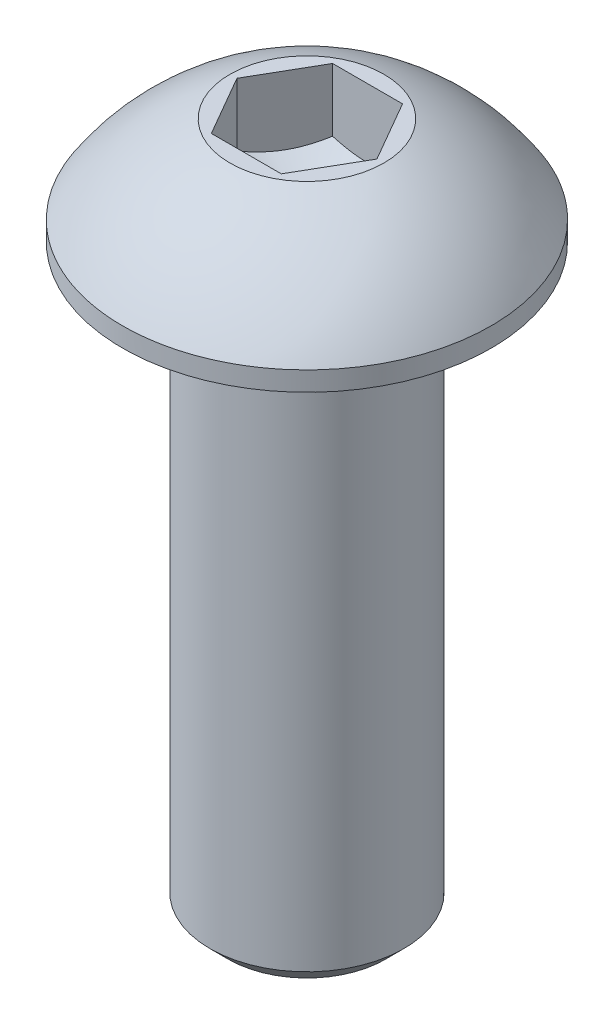
ISO-10303-21;
HEADER;
FILE_DESCRIPTION(('STEP AP214'),'2;1');
FILE_NAME('part.step','',(''),(''),'','','');
FILE_SCHEMA(('AUTOMOTIVE_DESIGN { 1 0 10303 214 1 1 1 1 }'));
ENDSEC;
DATA;
#1=APPLICATION_CONTEXT('core data for automotive mechanical design processes');
#2=APPLICATION_PROTOCOL_DEFINITION('international standard','automotive_design',2000,#1);
#3=PRODUCT_CONTEXT('',#1,'mechanical');
#4=PRODUCT('Part','Part','',(#3));
#5=PRODUCT_RELATED_PRODUCT_CATEGORY('part','',(#4));
#6=PRODUCT_DEFINITION_FORMATION('','',#4);
#7=PRODUCT_DEFINITION_CONTEXT('part definition',#1,'design');
#8=PRODUCT_DEFINITION('design','',#6,#7);
#9=PRODUCT_DEFINITION_SHAPE('','',#8);
#10=(LENGTH_UNIT() NAMED_UNIT(*) SI_UNIT(.MILLI.,.METRE.));
#11=(NAMED_UNIT(*) PLANE_ANGLE_UNIT() SI_UNIT($,.RADIAN.));
#12=(NAMED_UNIT(*) SI_UNIT($,.STERADIAN.) SOLID_ANGLE_UNIT());
#13=UNCERTAINTY_MEASURE_WITH_UNIT(LENGTH_MEASURE(1.E-05),#10,'distance_accuracy_value','');
#14=(GEOMETRIC_REPRESENTATION_CONTEXT(3) GLOBAL_UNCERTAINTY_ASSIGNED_CONTEXT((#13)) GLOBAL_UNIT_ASSIGNED_CONTEXT((#10,
#11,#12)) REPRESENTATION_CONTEXT('',''));
#15=CARTESIAN_POINT('',(0.,0.,0.));
#16=DIRECTION('',(0.,0.,1.));
#17=DIRECTION('',(1.,0.,0.));
#18=AXIS2_PLACEMENT_3D('',#15,#16,#17);
#19=CARTESIAN_POINT('',(-15.0000000000002,102.555381555476,30.9807621135335));
#20=DIRECTION('',(0.,1.,0.));
#21=DIRECTION('',(-1.,0.,0.));
#22=AXIS2_PLACEMENT_3D('',#19,#20,#21);
#23=CONICAL_SURFACE('',#22,1.45182112760699,1.04719755109359);
#24=CARTESIAN_POINT('',(-15.0000000000002,101.717172236562,30.980762113785));
#25=VERTEX_POINT('',#24);
#26=VERTEX_LOOP('',#25);
#27=FACE_BOUND('',#26,.T.);
#28=CARTESIAN_POINT('',(-13.5574990655018,102.550000607274,30.9807603764684));
#29=CARTESIAN_POINT('',(-13.5891805205812,102.531703843267,31.0356676529348));
#30=CARTESIAN_POINT('',(-13.62113547963,102.515065492705,31.0910488953439));
#31=CARTESIAN_POINT('',(-13.685598425334,102.486027407709,31.2027697944256));
#32=CARTESIAN_POINT('',(-13.7181075552304,102.473637942175,31.2591114323581));
#33=CARTESIAN_POINT('',(-13.7827225917517,102.454358012229,31.3710958918053));
#34=CARTESIAN_POINT('',(-13.8148185686046,102.447339054388,31.4267215037488));
#35=CARTESIAN_POINT('',(-13.8791609966882,102.438970015237,31.5382335123856));
#36=CARTESIAN_POINT('',(-13.9114072149847,102.437612989256,31.5941195053833));
#37=CARTESIAN_POINT('',(-13.9716827611401,102.44048562008,31.6985831898622));
#38=CARTESIAN_POINT('',(-13.9997211254395,102.444019311747,31.7471765423253));
#39=CARTESIAN_POINT('',(-14.0556146828759,102.455206810443,31.8440457927401));
#40=CARTESIAN_POINT('',(-14.0834696818395,102.462864438671,31.8923213541696));
#41=CARTESIAN_POINT('',(-14.1394779717146,102.48200201036,31.9893894475137));
#42=CARTESIAN_POINT('',(-14.1676241577382,102.493563031193,32.0381696659323));
#43=CARTESIAN_POINT('',(-14.2234962841293,102.519797677775,32.1350017740761));
#44=CARTESIAN_POINT('',(-14.251222942539,102.534465133045,32.1830549082417));
#45=CARTESIAN_POINT('',(-14.2787505845651,102.550379544181,32.2307631266443));
#46=B_SPLINE_CURVE_WITH_KNOTS('',3,(#28,#29,#30,#31,#32,#33,#34,#35,#36,#37,#38,#39,#40,#41,#42,
#43,#44,#45),.UNSPECIFIED.,.F.,.F.,(4,2,2,2,2,2,2,2,4),(0.,0.198016347622382,0.396507952132164,
0.590087601476021,0.78342974478089,0.951909558633603,1.1205457534758,1.2929254762051,
1.46496595034987),.UNSPECIFIED.);
#47=CARTESIAN_POINT('',(-13.5574990630935,102.550000540865,30.9807620206986));
#48=VERTEX_POINT('',#47);
#49=CARTESIAN_POINT('',(-14.2787492620422,102.550379666997,32.2307626091431));
#50=VERTEX_POINT('',#49);
#51=EDGE_CURVE('E179',#48,#50,#46,.T.);
#52=ORIENTED_EDGE('',*,*,#51,.F.);
#53=CARTESIAN_POINT('',(-14.2787504943466,102.550379471601,29.730760991602));
#54=CARTESIAN_POINT('',(-14.2470584298008,102.532051909017,29.7856867500078));
#55=CARTESIAN_POINT('',(-14.2150927772445,102.515380739633,29.841086564187));
#56=CARTESIAN_POINT('',(-14.1506074004958,102.48627437793,29.9528463670318));
#57=CARTESIAN_POINT('',(-14.1180865267501,102.473849490067,30.0092083477771));
#58=CARTESIAN_POINT('',(-14.0534475659173,102.454499072358,30.1212342630503));
#59=CARTESIAN_POINT('',(-14.021339445647,102.44744498488,30.1768809234764));
#60=CARTESIAN_POINT('',(-13.9569712944532,102.439008207814,30.2884375148538));
#61=CARTESIAN_POINT('',(-13.9247114989968,102.437618552084,30.3443470377239));
#62=CARTESIAN_POINT('',(-13.8644354281458,102.440434378395,30.4488116310948));
#63=CARTESIAN_POINT('',(-13.8364102202509,102.44393910656,30.4973821823196));
#64=CARTESIAN_POINT('',(-13.7805419182131,102.455067208677,30.5942076626616));
#65=CARTESIAN_POINT('',(-13.7526990169822,102.462694397776,30.6424622574421));
#66=CARTESIAN_POINT('',(-13.6967146777994,102.481770811203,30.7394888417539));
#67=CARTESIAN_POINT('',(-13.6685803224992,102.493301081399,30.7882485563276));
#68=CARTESIAN_POINT('',(-13.6127311824328,102.519475784029,30.8850408268371));
#69=CARTESIAN_POINT('',(-13.5850156823802,102.534114058097,30.9330746224374));
#70=CARTESIAN_POINT('',(-13.5574991160017,102.550000510319,30.9807636455933));
#71=B_SPLINE_CURVE_WITH_KNOTS('',3,(#53,#54,#55,#56,#57,#58,#59,#60,#61,#62,#63,#64,#65,#66,#67,
#68,#69,#70),.UNSPECIFIED.,.F.,.F.,(4,2,2,2,2,2,2,2,4),(0.,0.198103544046829,0.396684468192307,
0.590348093615976,0.783773478653186,0.952169177535142,1.12072098627908,1.2930125001826,
1.46496576037078),.UNSPECIFIED.);
#72=CARTESIAN_POINT('',(-14.2787488271113,102.550379803604,29.7307615957074));
#73=VERTEX_POINT('',#72);
#74=EDGE_CURVE('E21',#73,#48,#71,.T.);
#75=ORIENTED_EDGE('',*,*,#74,.F.);
#76=CARTESIAN_POINT('',(-15.7212520262085,102.550379872106,29.7307622375312));
#77=CARTESIAN_POINT('',(-15.6620437384385,102.533293767625,29.7307621580679));
#78=CARTESIAN_POINT('',(-15.6023673220094,102.517651639482,29.7307621254693));
#79=CARTESIAN_POINT('',(-15.482046005357,102.490006985419,29.7307621015713));
#80=CARTESIAN_POINT('',(-15.4213992550071,102.478012585961,29.7307621103633));
#81=CARTESIAN_POINT('',(-15.3007855761183,102.458724290398,29.73076211663));
#82=CARTESIAN_POINT('',(-15.2408355941973,102.451327651119,29.7307621143628));
#83=CARTESIAN_POINT('',(-15.1205901111891,102.441398176661,29.7307621127051));
#84=CARTESIAN_POINT('',(-15.060295055565,102.43886007296,29.7307621133114));
#85=CARTESIAN_POINT('',(-14.9397049409569,102.438860073232,29.7307621137556));
#86=CARTESIAN_POINT('',(-14.879409881973,102.441398177498,29.7307621135934));
#87=CARTESIAN_POINT('',(-14.7591643917228,102.45132765201,29.7307621134736));
#88=CARTESIAN_POINT('',(-14.6992144059197,102.458724290785,29.7307621135162));
#89=CARTESIAN_POINT('',(-14.5786007210093,102.478012592343,29.7307621135512));
#90=CARTESIAN_POINT('',(-14.5179539685635,102.490006998467,29.7307621135423));
#91=CARTESIAN_POINT('',(-14.3976326416881,102.517651640784,29.7307621135247));
#92=CARTESIAN_POINT('',(-14.3379562171402,102.533293750546,29.7307621135159));
#93=CARTESIAN_POINT('',(-14.2787479138666,102.550379808163,29.7307621135335));
#94=B_SPLINE_CURVE_WITH_KNOTS('',3,(#76,#77,#78,#79,#80,#81,#82,#83,#84,#85,#86,#87,#88,#89,#90,
#91,#92,#93),.UNSPECIFIED.,.F.,.F.,(4,2,2,2,2,2,2,2,4),(0.,0.184929667346248,0.37026835551581,
0.551300594741303,0.732136413949939,0.912972243591181,1.09400449357037,1.2793431927614,
1.4642728697994),.UNSPECIFIED.);
#95=CARTESIAN_POINT('',(-15.7212507379525,102.550379667054,29.7307616179303));
#96=VERTEX_POINT('',#95);
#97=EDGE_CURVE('E96',#96,#73,#94,.T.);
#98=ORIENTED_EDGE('',*,*,#97,.F.);
#99=CARTESIAN_POINT('',(-16.4425009344978,102.550000607324,30.9807638505793));
#100=CARTESIAN_POINT('',(-16.4108194794134,102.531703843322,30.9258565741157));
#101=CARTESIAN_POINT('',(-16.3788645203626,102.515065492762,30.870475331708));
#102=CARTESIAN_POINT('',(-16.3144015746578,102.486027407767,30.7587544326283));
#103=CARTESIAN_POINT('',(-16.2818924447624,102.473637942234,30.7024127946962));
#104=CARTESIAN_POINT('',(-16.2172774082421,102.454358012288,30.5904283352499));
#105=CARTESIAN_POINT('',(-16.1851814313894,102.447339054447,30.534802723307));
#106=CARTESIAN_POINT('',(-16.1208390033063,102.438970015297,30.4232907146714));
#107=CARTESIAN_POINT('',(-16.0885927850102,102.437612989317,30.3674047216743));
#108=CARTESIAN_POINT('',(-16.0283172388561,102.440485620141,30.2629410371976));
#109=CARTESIAN_POINT('',(-16.0002788745577,102.444019311808,30.2143476847363));
#110=CARTESIAN_POINT('',(-15.9443853171233,102.455206810504,30.1174784343248));
#111=CARTESIAN_POINT('',(-15.9165303181606,102.462864438732,30.069202872897));
#112=CARTESIAN_POINT('',(-15.8605220282875,102.48200201042,29.9721347795563));
#113=CARTESIAN_POINT('',(-15.8323758422649,102.493563031253,29.9233545611394));
#114=CARTESIAN_POINT('',(-15.7765037158758,102.519797677834,29.8265224529991));
#115=CARTESIAN_POINT('',(-15.7487770574671,102.534465133103,29.7784693188353));
#116=CARTESIAN_POINT('',(-15.721249415442,102.550379544239,29.7307611004344));
#117=B_SPLINE_CURVE_WITH_KNOTS('',3,(#99,#100,#101,#102,#103,#104,#105,#106,#107,#108,#109,#110,
#111,#112,#113,#114,#115,#116),.UNSPECIFIED.,.F.,.F.,(4,2,2,2,2,2,2,2,4),(0.,0.198016347619926,
0.396507952127413,0.590087601469302,0.783429744772117,0.951909558619024,1.12054575345543,
1.29292547617855,1.46496595031711),.UNSPECIFIED.);
#118=CARTESIAN_POINT('',(-16.4425009368986,102.550000540922,30.9807622063665));
#119=VERTEX_POINT('',#118);
#120=EDGE_CURVE('E162',#119,#96,#117,.T.);
#121=ORIENTED_EDGE('',*,*,#120,.F.);
#122=CARTESIAN_POINT('',(-15.7212493477698,102.5503795772,32.2307633239423));
#123=CARTESIAN_POINT('',(-15.7529414630259,102.532051972953,32.1758375963039));
#124=CARTESIAN_POINT('',(-15.7849071388111,102.51538078324,32.1204377905421));
#125=CARTESIAN_POINT('',(-15.8493925376681,102.486274400243,32.00867798507));
#126=CARTESIAN_POINT('',(-15.881913410231,102.473849511427,31.9523159932384));
#127=CARTESIAN_POINT('',(-15.9465523748812,102.454499087774,31.8402900620072));
#128=CARTESIAN_POINT('',(-15.9786604999778,102.44744499532,31.7846433965995));
#129=CARTESIAN_POINT('',(-16.0430286594051,102.43900821068,31.6730867934102));
#130=CARTESIAN_POINT('',(-16.0752884582712,102.437618552368,31.6171772637107));
#131=CARTESIAN_POINT('',(-16.1355645357735,102.440434374833,31.5127126582364));
#132=CARTESIAN_POINT('',(-16.1635897468415,102.443939101563,31.4641421017081));
#133=CARTESIAN_POINT('',(-16.2194580550697,102.455067201916,31.3673166107821));
#134=CARTESIAN_POINT('',(-16.2473009593182,102.462694390676,31.3190620107204));
#135=CARTESIAN_POINT('',(-16.3032853049824,102.48177080446,31.2220354151333));
#136=CARTESIAN_POINT('',(-16.3314196637412,102.493301075426,31.1732756945762));
#137=CARTESIAN_POINT('',(-16.3872688107207,102.519475780468,31.0764834121068));
#138=CARTESIAN_POINT('',(-16.414984314227,102.534114056186,31.0284496105316));
#139=CARTESIAN_POINT('',(-16.4425008839922,102.550000510377,30.980760581485));
#140=B_SPLINE_CURVE_WITH_KNOTS('',3,(#122,#123,#124,#125,#126,#127,#128,#129,#130,#131,#132,
#133,#134,#135,#136,#137,#138,#139),.UNSPECIFIED.,.F.,.F.,(4,2,2,2,2,2,2,2,4),(0.,
0.198103571827459,0.396684522252665,0.590348169774138,0.783773577541586,0.95216929465424,
1.12072112126508,1.29301265590712,1.46496593733162),.UNSPECIFIED.);
#141=CARTESIAN_POINT('',(-15.7212506140921,102.550379679614,32.2307627057194));
#142=VERTEX_POINT('',#141);
#143=EDGE_CURVE('E168',#142,#119,#140,.T.);
#144=ORIENTED_EDGE('',*,*,#143,.F.);
#145=CARTESIAN_POINT('',(-14.2787479737748,102.550379872055,32.2307619895269));
#146=CARTESIAN_POINT('',(-14.3379562615037,102.533293767661,32.2307620689968));
#147=CARTESIAN_POINT('',(-14.3976326778803,102.517651639561,32.2307621015973));
#148=CARTESIAN_POINT('',(-14.517953994407,102.490006985542,32.2307621254961));
#149=CARTESIAN_POINT('',(-14.5786007446837,102.478012586085,32.230762116703));
#150=CARTESIAN_POINT('',(-14.6992144235572,102.458724290498,32.2307621104376));
#151=CARTESIAN_POINT('',(-14.7591644055377,102.451327651204,32.2307621127071));
#152=CARTESIAN_POINT('',(-14.8794098886764,102.44139817673,32.2307621143591));
#153=CARTESIAN_POINT('',(-14.9397049443716,102.43886007303,32.2307621137448));
#154=CARTESIAN_POINT('',(-15.0602950424179,102.438860073295,32.2307621133006));
#155=CARTESIAN_POINT('',(-15.1205900847689,102.441398176148,32.2307621134707));
#156=CARTESIAN_POINT('',(-15.240835542019,102.451327645259,32.2307621135964));
#157=CARTESIAN_POINT('',(-15.3007855114554,102.458724280038,32.2307621135516));
#158=CARTESIAN_POINT('',(-15.4213991632183,102.478012571422,32.2307621135149));
#159=CARTESIAN_POINT('',(-15.482045898902,102.49000697128,32.2307621135242));
#160=CARTESIAN_POINT('',(-15.6023671929273,102.517651599646,32.2307621135428));
#161=CARTESIAN_POINT('',(-15.6620436013844,102.53329370173,32.230762113552));
#162=CARTESIAN_POINT('',(-15.7212518888142,102.550379751289,32.2307621135335));
#163=B_SPLINE_CURVE_WITH_KNOTS('',3,(#145,#146,#147,#148,#149,#150,#151,#152,#153,#154,#155,
#156,#157,#158,#159,#160,#161,#162),.UNSPECIFIED.,.F.,.F.,(4,2,2,2,2,2,2,2,4),(0.,
0.184929667161365,0.370268355116823,0.551300594525385,0.732136413937957,0.912972193728789,
1.09400439364097,1.27934303992631,1.4642726645233),.UNSPECIFIED.);
#164=EDGE_CURVE('E174',#50,#142,#163,.T.);
#165=ORIENTED_EDGE('',*,*,#164,.F.);
#166=EDGE_LOOP('',(#52,#75,#98,#121,#144,#165));
#167=FACE_BOUND('',#166,.T.);
#168=ADVANCED_FACE('F17',(#27,#167),#23,.F.);
#169=CARTESIAN_POINT('',(-13.5457747860707,101.610428354967,31.001083108212));
#170=DIRECTION('',(-0.866156744758905,0.,0.499772441725889));
#171=DIRECTION('',(0.499772441725889,0.,0.866156744758905));
#172=AXIS2_PLACEMENT_3D('',#169,#170,#171);
#173=PLANE('',#172);
#174=ORIENTED_EDGE('',*,*,#74,.T.);
#175=DIRECTION('',(0.,1.,0.));
#176=VECTOR('',#175,1.);
#177=CARTESIAN_POINT('',(-13.5575000000002,101.610428354967,30.9807621135335));
#178=LINE('',#177,#176);
#179=CARTESIAN_POINT('',(-13.5574998872849,103.85,30.9807627002865));
#180=VERTEX_POINT('',#179);
#181=EDGE_CURVE('E85',#180,#48,#178,.F.);
#182=ORIENTED_EDGE('',*,*,#181,.F.);
#183=DIRECTION('',(0.499772441725942,0.,0.866156744758874));
#184=VECTOR('',#183,1.);
#185=CARTESIAN_POINT('',(-14.2787500000003,103.85,29.7307621135335));
#186=LINE('',#185,#184);
#187=CARTESIAN_POINT('',(-14.2787470566511,103.85,29.7307621135335));
#188=VERTEX_POINT('',#187);
#189=EDGE_CURVE('E79',#188,#180,#186,.T.);
#190=ORIENTED_EDGE('',*,*,#189,.F.);
#191=DIRECTION('',(0.,1.,0.));
#192=VECTOR('',#191,1.);
#193=CARTESIAN_POINT('',(-14.2787470566511,101.610428354967,29.7307621135335));
#194=LINE('',#193,#192);
#195=EDGE_CURVE('E82',#73,#188,#194,.T.);
#196=ORIENTED_EDGE('',*,*,#195,.F.);
#197=EDGE_LOOP('',(#174,#182,#190,#196));
#198=FACE_BOUND('',#197,.T.);
#199=ADVANCED_FACE('F81',(#198),#173,.T.);
#200=CARTESIAN_POINT('',(-14.2904752139297,101.610428354967,32.2510831082121));
#201=DIRECTION('',(-0.866156744758906,0.,-0.499772441725888));
#202=DIRECTION('',(-0.499772441725888,0.,0.866156744758906));
#203=AXIS2_PLACEMENT_3D('',#200,#201,#202);
#204=PLANE('',#203);
#205=ORIENTED_EDGE('',*,*,#51,.T.);
#206=DIRECTION('',(0.,1.,0.));
#207=VECTOR('',#206,1.);
#208=CARTESIAN_POINT('',(-14.2787500000002,101.610428354967,32.2307621135335));
#209=LINE('',#208,#207);
#210=CARTESIAN_POINT('',(-14.2787502258028,103.85,32.2307621135335));
#211=VERTEX_POINT('',#210);
#212=EDGE_CURVE('E178',#211,#50,#209,.F.);
#213=ORIENTED_EDGE('',*,*,#212,.F.);
#214=DIRECTION('',(-0.499772441725887,0.,0.866156744758906));
#215=VECTOR('',#214,1.);
#216=CARTESIAN_POINT('',(-13.5575000000002,103.85,30.9807621135335));
#217=LINE('',#216,#215);
#218=EDGE_CURVE('E90',#180,#211,#217,.T.);
#219=ORIENTED_EDGE('',*,*,#218,.F.);
#220=ORIENTED_EDGE('',*,*,#181,.T.);
#221=EDGE_LOOP('',(#205,#213,#219,#220));
#222=FACE_BOUND('',#221,.T.);
#223=ADVANCED_FACE('F187',(#222),#204,.T.);
#224=CARTESIAN_POINT('',(-15.7447111053966,101.610428354967,32.2307621135335));
#225=DIRECTION('',(0.,0.,-1.));
#226=DIRECTION('',(-1.,0.,0.));
#227=AXIS2_PLACEMENT_3D('',#224,#225,#226);
#228=PLANE('',#227);
#229=ORIENTED_EDGE('',*,*,#164,.T.);
#230=DIRECTION('',(0.,1.,0.));
#231=VECTOR('',#230,1.);
#232=CARTESIAN_POINT('',(-15.7212500000002,101.610428354967,32.2307621135335));
#233=LINE('',#232,#231);
#234=CARTESIAN_POINT('',(-15.7212501837922,103.85,32.2307617950033));
#235=VERTEX_POINT('',#234);
#236=EDGE_CURVE('E173',#235,#142,#233,.F.);
#237=ORIENTED_EDGE('',*,*,#236,.F.);
#238=DIRECTION('',(1.,0.,0.));
#239=VECTOR('',#238,1.);
#240=CARTESIAN_POINT('',(-16.6184850000003,103.85,32.2307621135335));
#241=LINE('',#240,#239);
#242=EDGE_CURVE('E116',#211,#235,#241,.F.);
#243=ORIENTED_EDGE('',*,*,#242,.F.);
#244=ORIENTED_EDGE('',*,*,#212,.T.);
#245=EDGE_LOOP('',(#229,#237,#243,#244));
#246=FACE_BOUND('',#245,.T.);
#247=ADVANCED_FACE('F184',(#246),#228,.T.);
#248=CARTESIAN_POINT('',(-16.4542252139297,101.610428354967,30.960441118855));
#249=DIRECTION('',(0.866156744758905,0.,-0.499772441725889));
#250=DIRECTION('',(-0.499772441725889,0.,-0.866156744758905));
#251=AXIS2_PLACEMENT_3D('',#248,#249,#250);
#252=PLANE('',#251);
#253=ORIENTED_EDGE('',*,*,#143,.T.);
#254=DIRECTION('',(0.,1.,0.));
#255=VECTOR('',#254,1.);
#256=CARTESIAN_POINT('',(-16.4425000000002,101.610428354967,30.9807621135335));
#257=LINE('',#256,#255);
#258=CARTESIAN_POINT('',(-16.4424998306193,103.85,30.9807618199791));
#259=VERTEX_POINT('',#258);
#260=EDGE_CURVE('E167',#259,#119,#257,.F.);
#261=ORIENTED_EDGE('',*,*,#260,.F.);
#262=DIRECTION('',(-0.499772441725836,0.,-0.866156744758935));
#263=VECTOR('',#262,1.);
#264=CARTESIAN_POINT('',(-15.7212500000003,103.85,32.2307621135335));
#265=LINE('',#264,#263);
#266=EDGE_CURVE('E106',#235,#259,#265,.T.);
#267=ORIENTED_EDGE('',*,*,#266,.F.);
#268=ORIENTED_EDGE('',*,*,#236,.T.);
#269=EDGE_LOOP('',(#253,#261,#267,#268));
#270=FACE_BOUND('',#269,.T.);
#271=ADVANCED_FACE('F159',(#270),#252,.T.);
#272=CARTESIAN_POINT('',(-15.7095247860707,101.610428354967,29.710441118855));
#273=DIRECTION('',(0.866156744758906,0.,0.499772441725888));
#274=DIRECTION('',(0.499772441725888,0.,-0.866156744758906));
#275=AXIS2_PLACEMENT_3D('',#272,#273,#274);
#276=PLANE('',#275);
#277=ORIENTED_EDGE('',*,*,#120,.T.);
#278=DIRECTION('',(0.,1.,0.));
#279=VECTOR('',#278,1.);
#280=CARTESIAN_POINT('',(-15.7212500000003,101.610428354967,29.7307621135335));
#281=LINE('',#280,#279);
#282=CARTESIAN_POINT('',(-15.7212497741977,103.85,29.7307621135335));
#283=VERTEX_POINT('',#282);
#284=EDGE_CURVE('E40',#283,#96,#281,.F.);
#285=ORIENTED_EDGE('',*,*,#284,.F.);
#286=DIRECTION('',(0.499772441725838,0.,-0.866156744758934));
#287=VECTOR('',#286,1.);
#288=CARTESIAN_POINT('',(-16.4425000000002,103.85,30.9807621135335));
#289=LINE('',#288,#287);
#290=EDGE_CURVE('E100',#259,#283,#289,.T.);
#291=ORIENTED_EDGE('',*,*,#290,.F.);
#292=ORIENTED_EDGE('',*,*,#260,.T.);
#293=EDGE_LOOP('',(#277,#285,#291,#292));
#294=FACE_BOUND('',#293,.T.);
#295=ADVANCED_FACE('F155',(#294),#276,.T.);
#296=CARTESIAN_POINT('',(-14.2552888946038,101.610428354967,29.7307621135335));
#297=DIRECTION('',(0.,0.,1.));
#298=DIRECTION('',(1.,0.,0.));
#299=AXIS2_PLACEMENT_3D('',#296,#297,#298);
#300=PLANE('',#299);
#301=ORIENTED_EDGE('',*,*,#97,.T.);
#302=ORIENTED_EDGE('',*,*,#195,.T.);
#303=DIRECTION('',(1.,0.,0.));
#304=VECTOR('',#303,1.);
#305=CARTESIAN_POINT('',(-16.6184850000003,103.85,29.7307621135335));
#306=LINE('',#305,#304);
#307=EDGE_CURVE('E94',#283,#188,#306,.T.);
#308=ORIENTED_EDGE('',*,*,#307,.F.);
#309=ORIENTED_EDGE('',*,*,#284,.T.);
#310=EDGE_LOOP('',(#301,#302,#308,#309));
#311=FACE_BOUND('',#310,.T.);
#312=ADVANCED_FACE('F93',(#311),#300,.T.);
#313=CARTESIAN_POINT('',(-16.6184850000003,103.85,32.5992471135335));
#314=DIRECTION('',(0.,1.,0.));
#315=DIRECTION('',(0.,0.,1.));
#316=AXIS2_PLACEMENT_3D('',#313,#314,#315);
#317=PLANE('',#316);
#318=CARTESIAN_POINT('',(-15.0000000000002,103.85,29.3940121135328));
#319=CARTESIAN_POINT('',(-14.9109378537396,103.85,29.3940171562372));
#320=CARTESIAN_POINT('',(-14.8217172020801,103.85,29.4015517903201));
#321=CARTESIAN_POINT('',(-14.6898616124459,103.85,29.4239720132484));
#322=CARTESIAN_POINT('',(-14.6461831003795,103.85,29.4333180170197));
#323=CARTESIAN_POINT('',(-14.5597255050052,103.85,29.4556631094782));
#324=CARTESIAN_POINT('',(-14.5169471819952,103.85,29.4686651626666));
#325=CARTESIAN_POINT('',(-14.3906372924844,103.849999999999,29.512976532878));
#326=CARTESIAN_POINT('',(-14.3089182050352,103.85,29.5496274550387));
#327=CARTESIAN_POINT('',(-14.1527995679231,103.85,29.6361464158282));
#328=CARTESIAN_POINT('',(-14.0784002966543,103.849999999999,29.6860149568957));
#329=CARTESIAN_POINT('',(-13.97390724967,103.85,29.7696025553537));
#330=CARTESIAN_POINT('',(-13.940240858888,103.85,29.7989512901898));
#331=CARTESIAN_POINT('',(-13.8755292101654,103.85,29.860347522271));
#332=CARTESIAN_POINT('',(-13.8444814563538,103.85,29.8923923902206));
#333=CARTESIAN_POINT('',(-13.7555379346321,103.85,29.9923150171317));
#334=CARTESIAN_POINT('',(-13.7018193042052,103.85,30.0639989157315));
#335=CARTESIAN_POINT('',(-13.6072110661829,103.85,30.2153289192023));
#336=CARTESIAN_POINT('',(-13.5663209748428,103.85,30.2949747236924));
#337=CARTESIAN_POINT('',(-13.4984850514246,103.85,30.4600095800104));
#338=CARTESIAN_POINT('',(-13.4715390704169,103.85,30.5453985704873));
#339=CARTESIAN_POINT('',(-13.4323672519403,103.85,30.7194864463113));
#340=CARTESIAN_POINT('',(-13.4201414930837,103.85,30.8081853493321));
#341=CARTESIAN_POINT('',(-13.4107536009079,103.85,30.9863767720929));
#342=CARTESIAN_POINT('',(-13.4135914675886,103.85,31.075869291833));
#343=CARTESIAN_POINT('',(-13.4342538089125,103.85,31.2531094890871));
#344=CARTESIAN_POINT('',(-13.4520782035215,103.85,31.3408571759167));
#345=CARTESIAN_POINT('',(-13.502197231768,103.85,31.5121064074873));
#346=CARTESIAN_POINT('',(-13.5344920199573,103.85,31.5956079068661));
#347=CARTESIAN_POINT('',(-13.6126752180932,103.85,31.7560413079437));
#348=CARTESIAN_POINT('',(-13.6585641406696,103.85,31.8329729617552));
#349=CARTESIAN_POINT('',(-13.7365157129445,103.85,31.9416883415545));
#350=CARTESIAN_POINT('',(-13.7640244118057,103.85,31.9768182158158));
#351=CARTESIAN_POINT('',(-13.821926493119,103.85,32.0446742676736));
#352=CARTESIAN_POINT('',(-13.8523226339036,103.85,32.0773980927886));
#353=CARTESIAN_POINT('',(-13.9474540859192,103.85,32.1715027702573));
#354=CARTESIAN_POINT('',(-14.0162014547784,103.85,32.228912893306));
#355=CARTESIAN_POINT('',(-14.1623646837784,103.85,32.3313573656704));
#356=CARTESIAN_POINT('',(-14.2397802142715,103.85,32.3763921853905));
#357=CARTESIAN_POINT('',(-14.3607347596442,103.85,32.4337305117696));
#358=CARTESIAN_POINT('',(-14.4019100495344,103.85,32.4511556031357));
#359=CARTESIAN_POINT('',(-14.4855410691741,103.85,32.4824616969344));
#360=CARTESIAN_POINT('',(-14.5279957313337,103.85,32.4963455675672));
#361=CARTESIAN_POINT('',(-14.6567655316593,103.85,32.5324966593632));
#362=CARTESIAN_POINT('',(-14.7447005495728,103.849999999999,32.5493646176817));
#363=CARTESIAN_POINT('',(-14.8609649500687,103.85,32.5616559914841));
#364=CARTESIAN_POINT('',(-14.8887227260791,103.85,32.5638501418058));
#365=CARTESIAN_POINT('',(-14.9443151682786,103.85,32.5667789912699));
#366=CARTESIAN_POINT('',(-14.9721498344676,103.85,32.5675136904124));
#367=CARTESIAN_POINT('',(-15.0890621462608,103.85,32.5675070708298));
#368=CARTESIAN_POINT('',(-15.1782827979203,103.85,32.5599724367469));
#369=CARTESIAN_POINT('',(-15.3101383875545,103.85,32.5375522138186));
#370=CARTESIAN_POINT('',(-15.3538168996209,103.85,32.5282062100472));
#371=CARTESIAN_POINT('',(-15.4402744949952,103.85,32.5058611175888));
#372=CARTESIAN_POINT('',(-15.4830528180053,103.85,32.4928590644004));
#373=CARTESIAN_POINT('',(-15.609362707516,103.849999999999,32.448547694189));
#374=CARTESIAN_POINT('',(-15.6910817949652,103.85,32.4118967720283));
#375=CARTESIAN_POINT('',(-15.8472004320773,103.85,32.3253778112388));
#376=CARTESIAN_POINT('',(-15.9215997033461,103.849999999999,32.2755092701713));
#377=CARTESIAN_POINT('',(-16.0260927503304,103.85,32.1919216717133));
#378=CARTESIAN_POINT('',(-16.0597591411124,103.85,32.1625729368772));
#379=CARTESIAN_POINT('',(-16.124470789835,103.85,32.1011767047959));
#380=CARTESIAN_POINT('',(-16.1555185436466,103.85,32.0691318368464));
#381=CARTESIAN_POINT('',(-16.2444620653683,103.85,31.9692092099353));
#382=CARTESIAN_POINT('',(-16.2981806957952,103.85,31.8975253113355));
#383=CARTESIAN_POINT('',(-16.3927889338175,103.85,31.7461953078647));
#384=CARTESIAN_POINT('',(-16.4336790251576,103.85,31.6665495033745));
#385=CARTESIAN_POINT('',(-16.5015149485758,103.85,31.5015146470566));
#386=CARTESIAN_POINT('',(-16.5284609295836,103.85,31.4161256565797));
#387=CARTESIAN_POINT('',(-16.5676327480601,103.85,31.2420377807557));
#388=CARTESIAN_POINT('',(-16.5798585069167,103.85,31.1533388777349));
#389=CARTESIAN_POINT('',(-16.5892463990925,103.85,30.975147454974));
#390=CARTESIAN_POINT('',(-16.5864085324118,103.85,30.885654935234));
#391=CARTESIAN_POINT('',(-16.5657461910879,103.85,30.7084147379799));
#392=CARTESIAN_POINT('',(-16.547921796479,103.85,30.6206670511503));
#393=CARTESIAN_POINT('',(-16.4978027682324,103.85,30.4494178195797));
#394=CARTESIAN_POINT('',(-16.4655079800431,103.85,30.3659163202009));
#395=CARTESIAN_POINT('',(-16.3873247819072,103.85,30.2054829191232));
#396=CARTESIAN_POINT('',(-16.3414358593308,103.85,30.1285512653118));
#397=CARTESIAN_POINT('',(-16.2634842870558,103.85,30.0198358855125));
#398=CARTESIAN_POINT('',(-16.2359755881947,103.85,29.9847060112512));
#399=CARTESIAN_POINT('',(-16.1780735068814,103.85,29.9168499593934));
#400=CARTESIAN_POINT('',(-16.1476773660968,103.85,29.8841261342784));
#401=CARTESIAN_POINT('',(-16.0525459140812,103.85,29.7900214568097));
#402=CARTESIAN_POINT('',(-15.983798545222,103.85,29.732611333761));
#403=CARTESIAN_POINT('',(-15.837635316222,103.85,29.6301668613966));
#404=CARTESIAN_POINT('',(-15.7602197857289,103.85,29.5851320416765));
#405=CARTESIAN_POINT('',(-15.6392652403562,103.85,29.5277937152974));
#406=CARTESIAN_POINT('',(-15.5980899504659,103.85,29.5103686239313));
#407=CARTESIAN_POINT('',(-15.5144589308263,103.85,29.4790625301326));
#408=CARTESIAN_POINT('',(-15.4720042686667,103.85,29.4651786594998));
#409=CARTESIAN_POINT('',(-15.3432344683411,103.85,29.4290275677039));
#410=CARTESIAN_POINT('',(-15.2552994504276,103.849999999999,29.4121596093853));
#411=CARTESIAN_POINT('',(-15.1390350499317,103.85,29.3998682355829));
#412=CARTESIAN_POINT('',(-15.1112772739213,103.85,29.3976740852612));
#413=CARTESIAN_POINT('',(-15.0556848317218,103.85,29.3947452357971));
#414=CARTESIAN_POINT('',(-15.0278501655328,103.85,29.3940105366546));
#415=CARTESIAN_POINT('',(-15.0000000000002,103.85,29.3940121135328));
#416=B_SPLINE_CURVE_WITH_KNOTS('',3,(#318,#319,#320,#321,#322,#323,#324,#325,#326,#327,#328,
#329,#330,#331,#332,#333,#334,#335,#336,#337,#338,#339,#340,#341,#342,#343,#344,#345,#346,#347,
#348,#349,#350,#351,#352,#353,#354,#355,#356,#357,#358,#359,#360,#361,#362,#363,#364,#365,#366,
#367,#368,#369,#370,#371,#372,#373,#374,#375,#376,#377,#378,#379,#380,#381,#382,#383,#384,#385,
#386,#387,#388,#389,#390,#391,#392,#393,#394,#395,#396,#397,#398,#399,#400,#401,#402,#403,#404,
#405,#406,#407,#408,#409,#410,#411,#412,#413,#414,#415),.UNSPECIFIED.,.T.,.F.,(4,2,2,2,2,2,2,2,
2,2,2,2,2,2,2,2,2,2,2,2,2,2,2,2,2,2,2,2,2,2,2,2,2,2,2,2,2,2,2,2,2,2,2,2,2,2,2,2,4),(0.,
0.267056844438345,0.400936254326084,0.534924534694724,0.80226238912951,1.0696104072824,
1.20345957924893,1.33717970045395,1.60453414720255,1.87187851120746,2.13922001979082,
2.40656295608497,2.67390589237913,2.94124740096248,3.2085917649674,3.47594621171572,
3.60966633292054,3.74351550488691,4.01086352303985,4.27820137747456,4.4121896578433,
4.54606906773124,4.8131259121691,4.89663588398656,4.98014585580407,5.24720270024242,
5.38108211013016,5.51507039049879,5.78240824493359,6.04975626308649,6.18360543505302,
6.31732555625804,6.58468000300664,6.85202436701155,7.1193658755949,7.38670881188905,
7.65405174818322,7.92139325676658,8.18873762077149,8.45609206751981,8.58981218872463,
8.72366136069101,8.99100937884394,9.25834723327863,9.39233551364737,9.52621492353531,
9.79327176797317,9.87678173979062,9.96029171160813),.UNSPECIFIED.);
#417=CARTESIAN_POINT('',(-15.0000000000002,103.85,29.3940121135328));
#418=VERTEX_POINT('',#417);
#419=EDGE_CURVE('E101',#418,#418,#416,.T.);
#420=ORIENTED_EDGE('',*,*,#419,.F.);
#421=EDGE_LOOP('',(#420));
#422=FACE_BOUND('',#421,.T.);
#423=ORIENTED_EDGE('',*,*,#290,.T.);
#424=ORIENTED_EDGE('',*,*,#307,.T.);
#425=ORIENTED_EDGE('',*,*,#189,.T.);
#426=ORIENTED_EDGE('',*,*,#218,.T.);
#427=ORIENTED_EDGE('',*,*,#242,.T.);
#428=ORIENTED_EDGE('',*,*,#266,.T.);
#429=EDGE_LOOP('',(#423,#424,#425,#426,#427,#428));
#430=FACE_BOUND('',#429,.T.);
#431=ADVANCED_FACE('F98',(#422,#430),#317,.T.);
#432=CARTESIAN_POINT('',(-15.0000000000002,99.6382709895836,30.9807621135335));
#433=DIRECTION('',(0.,0.,-1.));
#434=DIRECTION('',(1.,0.,0.));
#435=AXIS2_PLACEMENT_3D('',#432,#433,#434);
#436=SPHERICAL_SURFACE('',#435,4.50071514536138);
#437=ORIENTED_EDGE('',*,*,#419,.T.);
#438=EDGE_LOOP('',(#437));
#439=FACE_BOUND('',#438,.T.);
#440=CARTESIAN_POINT('',(-15.0000000000002,102.05,30.9807621135335));
#441=DIRECTION('',(0.,-1.,0.));
#442=DIRECTION('',(0.,0.,-1.));
#443=AXIS2_PLACEMENT_3D('',#440,#441,#442);
#444=CIRCLE('',#443,3.8);
#445=CARTESIAN_POINT('',(-15.0000000000002,102.05,27.1807621135335));
#446=VERTEX_POINT('',#445);
#447=EDGE_CURVE('E104',#446,#446,#444,.T.);
#448=ORIENTED_EDGE('',*,*,#447,.F.);
#449=EDGE_LOOP('',(#448));
#450=FACE_BOUND('',#449,.T.);
#451=ADVANCED_FACE('F145',(#439,#450),#436,.T.);
#452=CARTESIAN_POINT('',(-15.0000000000002,102.05,30.9807621135335));
#453=DIRECTION('',(0.,-1.,0.));
#454=DIRECTION('',(0.,0.,-1.));
#455=AXIS2_PLACEMENT_3D('',#452,#453,#454);
#456=CYLINDRICAL_SURFACE('',#455,3.8);
#457=ORIENTED_EDGE('',*,*,#447,.T.);
#458=EDGE_LOOP('',(#457));
#459=FACE_BOUND('',#458,.T.);
#460=CARTESIAN_POINT('',(-15.0000000000002,101.65,30.9807621135335));
#461=DIRECTION('',(0.,-1.,0.));
#462=DIRECTION('',(0.,0.,-1.));
#463=AXIS2_PLACEMENT_3D('',#460,#461,#462);
#464=CIRCLE('',#463,3.8);
#465=CARTESIAN_POINT('',(-15.0000000000002,101.65,27.1807621135335));
#466=VERTEX_POINT('',#465);
#467=EDGE_CURVE('E131',#466,#466,#464,.T.);
#468=ORIENTED_EDGE('',*,*,#467,.F.);
#469=EDGE_LOOP('',(#468));
#470=FACE_BOUND('',#469,.T.);
#471=ADVANCED_FACE('F220',(#459,#470),#456,.T.);
#472=CARTESIAN_POINT('',(-11.1240000000003,101.65,34.8567621135335));
#473=DIRECTION('',(0.,-1.,0.));
#474=DIRECTION('',(0.,0.,-1.));
#475=AXIS2_PLACEMENT_3D('',#472,#473,#474);
#476=PLANE('',#475);
#477=ORIENTED_EDGE('',*,*,#467,.T.);
#478=EDGE_LOOP('',(#477));
#479=FACE_BOUND('',#478,.T.);
#480=CARTESIAN_POINT('',(-15.0000000000002,101.65,30.9807621135335));
#481=DIRECTION('',(0.,-1.,0.));
#482=DIRECTION('',(0.,0.,-1.));
#483=AXIS2_PLACEMENT_3D('',#480,#481,#482);
#484=CIRCLE('',#483,2.);
#485=CARTESIAN_POINT('',(-15.0000000000002,101.65,28.9807621135335));
#486=VERTEX_POINT('',#485);
#487=EDGE_CURVE('E128',#486,#486,#484,.T.);
#488=ORIENTED_EDGE('',*,*,#487,.F.);
#489=EDGE_LOOP('',(#488));
#490=FACE_BOUND('',#489,.T.);
#491=ADVANCED_FACE('F217',(#479,#490),#476,.T.);
#492=CARTESIAN_POINT('',(-13.0000000000002,89.6500000000003,32.9807621135335));
#493=DIRECTION('',(0.,-1.,0.));
#494=DIRECTION('',(0.,0.,-1.));
#495=AXIS2_PLACEMENT_3D('',#492,#493,#494);
#496=PLANE('',#495);
#497=CARTESIAN_POINT('',(-15.0000000000002,89.6499999999776,30.9807621135335));
#498=DIRECTION('',(0.,1.,0.));
#499=DIRECTION('',(0.,0.,1.));
#500=AXIS2_PLACEMENT_3D('',#497,#498,#499);
#501=CIRCLE('',#500,1.62116757675358);
#502=CARTESIAN_POINT('',(-15.0000000000002,89.6499999999776,32.6019296902871));
#503=VERTEX_POINT('',#502);
#504=EDGE_CURVE('E31',#503,#503,#501,.T.);
#505=ORIENTED_EDGE('',*,*,#504,.F.);
#506=EDGE_LOOP('',(#505));
#507=FACE_BOUND('',#506,.T.);
#508=ADVANCED_FACE('F210',(#507),#496,.T.);
#509=CARTESIAN_POINT('',(-15.0000000000002,90.0288324232861,30.9807621135335));
#510=DIRECTION('',(0.,1.,0.));
#511=DIRECTION('',(0.,0.,1.));
#512=AXIS2_PLACEMENT_3D('',#509,#510,#511);
#513=CONICAL_SURFACE('',#512,2.00000000000523,0.785398163322424);
#514=CARTESIAN_POINT('',(-15.0000000000002,90.0288324233518,30.9807621135335));
#515=DIRECTION('',(0.,1.,0.));
#516=DIRECTION('',(0.,0.,1.));
#517=AXIS2_PLACEMENT_3D('',#514,#515,#516);
#518=CIRCLE('',#517,2.);
#519=CARTESIAN_POINT('',(-15.0000000000002,90.0288324233518,32.9807621135335));
#520=VERTEX_POINT('',#519);
#521=EDGE_CURVE('E11',#520,#520,#518,.T.);
#522=ORIENTED_EDGE('',*,*,#521,.F.);
#523=EDGE_LOOP('',(#522));
#524=FACE_BOUND('',#523,.T.);
#525=ORIENTED_EDGE('',*,*,#504,.T.);
#526=EDGE_LOOP('',(#525));
#527=FACE_BOUND('',#526,.T.);
#528=ADVANCED_FACE('F204',(#524,#527),#513,.T.);
#529=CARTESIAN_POINT('',(-15.0000000000002,100.95001399972,30.9807621135335));
#530=DIRECTION('',(0.,1.,0.));
#531=DIRECTION('',(0.,0.,1.));
#532=AXIS2_PLACEMENT_3D('',#529,#530,#531);
#533=CYLINDRICAL_SURFACE('',#532,2.);
#534=ORIENTED_EDGE('',*,*,#487,.T.);
#535=EDGE_LOOP('',(#534));
#536=FACE_BOUND('',#535,.T.);
#537=ORIENTED_EDGE('',*,*,#521,.T.);
#538=EDGE_LOOP('',(#537));
#539=FACE_BOUND('',#538,.T.);
#540=ADVANCED_FACE('F202',(#536,#539),#533,.T.);
#541=CLOSED_SHELL('',(#168,#199,#223,#247,#271,#295,#312,#431,#451,#471,#491,#508,#528,#540));
#542=MANIFOLD_SOLID_BREP('B1',#541);
#543=ADVANCED_BREP_SHAPE_REPRESENTATION('',(#18,#542),#14);
#544=SHAPE_DEFINITION_REPRESENTATION(#9,#543);
ENDSEC;
END-ISO-10303-21;
